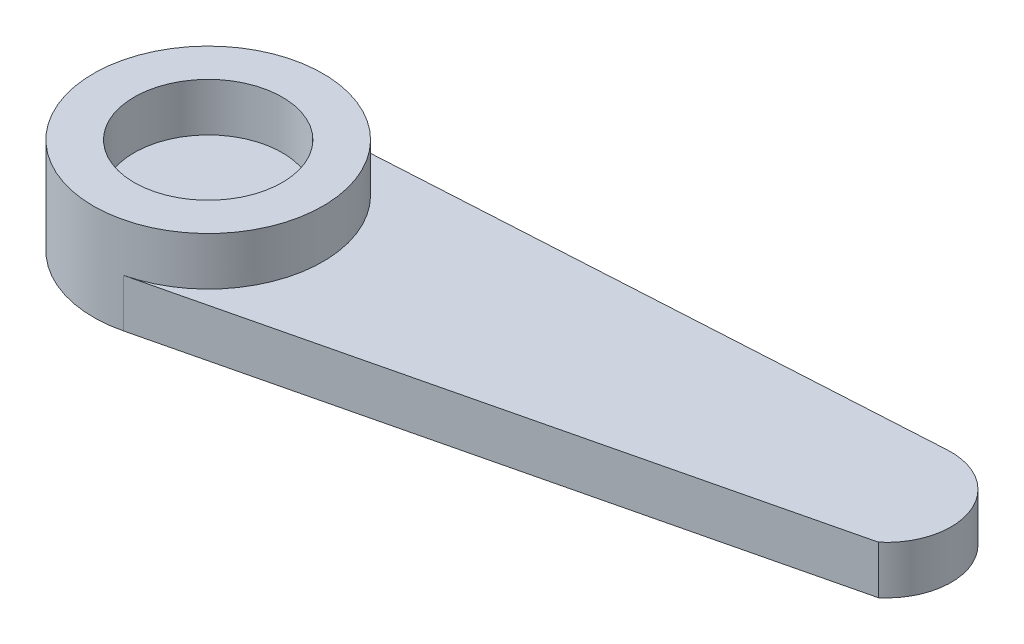
ISO-10303-21;
HEADER;
FILE_DESCRIPTION(('STEP AP214'),'2;1');
FILE_NAME('part.step','',(''),(''),'','','');
FILE_SCHEMA(('AUTOMOTIVE_DESIGN { 1 0 10303 214 1 1 1 1 }'));
ENDSEC;
DATA;
#1=APPLICATION_CONTEXT('core data for automotive mechanical design processes');
#2=APPLICATION_PROTOCOL_DEFINITION('international standard','automotive_design',2000,#1);
#3=PRODUCT_CONTEXT('',#1,'mechanical');
#4=PRODUCT('Part','Part','',(#3));
#5=PRODUCT_RELATED_PRODUCT_CATEGORY('part','',(#4));
#6=PRODUCT_DEFINITION_FORMATION('','',#4);
#7=PRODUCT_DEFINITION_CONTEXT('part definition',#1,'design');
#8=PRODUCT_DEFINITION('design','',#6,#7);
#9=PRODUCT_DEFINITION_SHAPE('','',#8);
#10=(LENGTH_UNIT() NAMED_UNIT(*) SI_UNIT(.MILLI.,.METRE.));
#11=(NAMED_UNIT(*) PLANE_ANGLE_UNIT() SI_UNIT($,.RADIAN.));
#12=(NAMED_UNIT(*) SI_UNIT($,.STERADIAN.) SOLID_ANGLE_UNIT());
#13=UNCERTAINTY_MEASURE_WITH_UNIT(LENGTH_MEASURE(1.E-05),#10,'distance_accuracy_value','');
#14=(GEOMETRIC_REPRESENTATION_CONTEXT(3) GLOBAL_UNCERTAINTY_ASSIGNED_CONTEXT((#13)) GLOBAL_UNIT_ASSIGNED_CONTEXT((#10,
#11,#12)) REPRESENTATION_CONTEXT('',''));
#15=CARTESIAN_POINT('',(0.,0.,0.));
#16=DIRECTION('',(0.,0.,1.));
#17=DIRECTION('',(1.,0.,0.));
#18=AXIS2_PLACEMENT_3D('',#15,#16,#17);
#19=CARTESIAN_POINT('',(0.,1.3,0.));
#20=DIRECTION('',(0.,-1.,0.));
#21=DIRECTION('',(0.,0.,-1.));
#22=AXIS2_PLACEMENT_3D('',#19,#20,#21);
#23=CYLINDRICAL_SURFACE('',#22,3.1);
#24=CARTESIAN_POINT('',(0.,0.,0.));
#25=DIRECTION('',(0.,1.,0.));
#26=DIRECTION('',(0.,0.,1.));
#27=AXIS2_PLACEMENT_3D('',#24,#25,#26);
#28=CIRCLE('',#27,3.1);
#29=CARTESIAN_POINT('',(-0.178960563613639,0.,-3.0948300626482));
#30=VERTEX_POINT('',#29);
#31=CARTESIAN_POINT('',(0.72507649934474,0.,3.01401129229769));
#32=VERTEX_POINT('',#31);
#33=EDGE_CURVE('E90',#30,#32,#28,.T.);
#34=ORIENTED_EDGE('',*,*,#33,.T.);
#35=DIRECTION('',(0.,-1.,0.));
#36=VECTOR('',#35,1.);
#37=CARTESIAN_POINT('',(0.72507649934474,1.3,3.01401129229769));
#38=LINE('',#37,#36);
#39=CARTESIAN_POINT('',(0.72507649934474,1.3,3.01401129229769));
#40=VERTEX_POINT('',#39);
#41=EDGE_CURVE('E11',#40,#32,#38,.T.);
#42=ORIENTED_EDGE('',*,*,#41,.F.);
#43=CARTESIAN_POINT('',(0.,1.3,0.));
#44=DIRECTION('',(0.,1.,0.));
#45=DIRECTION('',(0.,0.,1.));
#46=AXIS2_PLACEMENT_3D('',#43,#44,#45);
#47=CIRCLE('',#46,3.1);
#48=CARTESIAN_POINT('',(-0.178960563613639,1.3,-3.0948300626482));
#49=VERTEX_POINT('',#48);
#50=EDGE_CURVE('E88',#40,#49,#47,.T.);
#51=ORIENTED_EDGE('',*,*,#50,.T.);
#52=DIRECTION('',(0.,-1.,0.));
#53=VECTOR('',#52,1.);
#54=CARTESIAN_POINT('',(-0.178960563613639,1.3,-3.0948300626482));
#55=LINE('',#54,#53);
#56=EDGE_CURVE('E109',#49,#30,#55,.T.);
#57=ORIENTED_EDGE('',*,*,#56,.T.);
#58=EDGE_LOOP('',(#34,#42,#51,#57));
#59=FACE_BOUND('',#58,.T.);
#60=CARTESIAN_POINT('',(0.,2.6,0.));
#61=DIRECTION('',(0.,1.,0.));
#62=DIRECTION('',(0.,0.,1.));
#63=AXIS2_PLACEMENT_3D('',#60,#61,#62);
#64=CIRCLE('',#63,3.1);
#65=CARTESIAN_POINT('',(0.,2.6,3.1));
#66=VERTEX_POINT('',#65);
#67=EDGE_CURVE('E97',#66,#66,#64,.T.);
#68=ORIENTED_EDGE('',*,*,#67,.F.);
#69=EDGE_LOOP('',(#68));
#70=FACE_BOUND('',#69,.T.);
#71=ADVANCED_FACE('F37',(#59,#70),#23,.T.);
#72=CARTESIAN_POINT('',(0.72507649934474,1.3,3.01401129229769));
#73=DIRECTION('',(-0.233895644949916,0.,-0.972261707192802));
#74=DIRECTION('',(-0.972261707192802,0.,0.233895644949916));
#75=AXIS2_PLACEMENT_3D('',#72,#73,#74);
#76=PLANE('',#75);
#77=DIRECTION('',(0.972261707192802,0.,-0.233895644949916));
#78=VECTOR('',#77,1.);
#79=CARTESIAN_POINT('',(0.72507649934474,0.,3.01401129229769));
#80=LINE('',#79,#78);
#81=CARTESIAN_POINT('',(17.1590696545849,0.,-0.939491555454773));
#82=VERTEX_POINT('',#81);
#83=EDGE_CURVE('E111',#32,#82,#80,.T.);
#84=ORIENTED_EDGE('',*,*,#83,.T.);
#85=DIRECTION('',(0.,-1.,0.));
#86=VECTOR('',#85,1.);
#87=CARTESIAN_POINT('',(17.1590696545849,1.3,-0.939491555454773));
#88=LINE('',#87,#86);
#89=CARTESIAN_POINT('',(17.1590696545849,1.3,-0.939491555454773));
#90=VERTEX_POINT('',#89);
#91=EDGE_CURVE('E45',#90,#82,#88,.T.);
#92=ORIENTED_EDGE('',*,*,#91,.F.);
#93=DIRECTION('',(0.972261707192802,0.,-0.233895644949916));
#94=VECTOR('',#93,1.);
#95=CARTESIAN_POINT('',(0.72507649934474,1.3,3.01401129229769));
#96=LINE('',#95,#94);
#97=EDGE_CURVE('E80',#40,#90,#96,.T.);
#98=ORIENTED_EDGE('',*,*,#97,.F.);
#99=ORIENTED_EDGE('',*,*,#41,.T.);
#100=EDGE_LOOP('',(#84,#92,#98,#99));
#101=FACE_BOUND('',#100,.T.);
#102=ADVANCED_FACE('F92',(#101),#76,.F.);
#103=CARTESIAN_POINT('',(16.0333898491626,1.3,-2.27939639374158));
#104=DIRECTION('',(0.,-1.,0.));
#105=DIRECTION('',(0.,0.,-1.));
#106=AXIS2_PLACEMENT_3D('',#103,#104,#105);
#107=CYLINDRICAL_SURFACE('',#106,1.75);
#108=CARTESIAN_POINT('',(16.0333898491626,0.,-2.27939639374158));
#109=DIRECTION('',(0.,1.,0.));
#110=DIRECTION('',(0.,0.,1.));
#111=AXIS2_PLACEMENT_3D('',#108,#109,#110);
#112=CIRCLE('',#111,1.75);
#113=CARTESIAN_POINT('',(15.932363724542,0.,-4.0264778807204));
#114=VERTEX_POINT('',#113);
#115=EDGE_CURVE('E71',#82,#114,#112,.T.);
#116=ORIENTED_EDGE('',*,*,#115,.T.);
#117=DIRECTION('',(0.,-1.,0.));
#118=VECTOR('',#117,1.);
#119=CARTESIAN_POINT('',(15.932363724542,1.3,-4.0264778807204));
#120=LINE('',#119,#118);
#121=CARTESIAN_POINT('',(15.932363724542,1.3,-4.0264778807204));
#122=VERTEX_POINT('',#121);
#123=EDGE_CURVE('E116',#122,#114,#120,.T.);
#124=ORIENTED_EDGE('',*,*,#123,.F.);
#125=CARTESIAN_POINT('',(16.0333898491626,1.3,-2.27939639374158));
#126=DIRECTION('',(0.,1.,0.));
#127=DIRECTION('',(0.,0.,1.));
#128=AXIS2_PLACEMENT_3D('',#125,#126,#127);
#129=CIRCLE('',#128,1.75);
#130=EDGE_CURVE('E94',#90,#122,#129,.T.);
#131=ORIENTED_EDGE('',*,*,#130,.F.);
#132=ORIENTED_EDGE('',*,*,#91,.T.);
#133=EDGE_LOOP('',(#116,#124,#131,#132));
#134=FACE_BOUND('',#133,.T.);
#135=ADVANCED_FACE('F117',(#134),#107,.T.);
#136=CARTESIAN_POINT('',(-0.178960563613639,1.3,-3.0948300626482));
#137=DIRECTION('',(0.0577292140689159,0.,0.998332278273614));
#138=DIRECTION('',(0.998332278273614,0.,-0.0577292140689159));
#139=AXIS2_PLACEMENT_3D('',#136,#137,#138);
#140=PLANE('',#139);
#141=DIRECTION('',(-0.998332278273614,0.,0.0577292140689159));
#142=VECTOR('',#141,1.);
#143=CARTESIAN_POINT('',(-0.178960563613639,0.,-3.0948300626482));
#144=LINE('',#143,#142);
#145=EDGE_CURVE('E76',#114,#30,#144,.T.);
#146=ORIENTED_EDGE('',*,*,#145,.T.);
#147=ORIENTED_EDGE('',*,*,#56,.F.);
#148=DIRECTION('',(-0.998332278273614,0.,0.0577292140689159));
#149=VECTOR('',#148,1.);
#150=CARTESIAN_POINT('',(-0.178960563613639,1.3,-3.0948300626482));
#151=LINE('',#150,#149);
#152=EDGE_CURVE('E53',#122,#49,#151,.T.);
#153=ORIENTED_EDGE('',*,*,#152,.F.);
#154=ORIENTED_EDGE('',*,*,#123,.T.);
#155=EDGE_LOOP('',(#146,#147,#153,#154));
#156=FACE_BOUND('',#155,.T.);
#157=ADVANCED_FACE('F130',(#156),#140,.F.);
#158=CARTESIAN_POINT('',(0.,1.3,0.));
#159=DIRECTION('',(0.,1.,0.));
#160=DIRECTION('',(0.,0.,1.));
#161=AXIS2_PLACEMENT_3D('',#158,#159,#160);
#162=PLANE('',#161);
#163=ORIENTED_EDGE('',*,*,#50,.F.);
#164=ORIENTED_EDGE('',*,*,#97,.T.);
#165=ORIENTED_EDGE('',*,*,#130,.T.);
#166=ORIENTED_EDGE('',*,*,#152,.T.);
#167=EDGE_LOOP('',(#163,#164,#165,#166));
#168=FACE_BOUND('',#167,.T.);
#169=ADVANCED_FACE('F96',(#168),#162,.T.);
#170=CARTESIAN_POINT('',(0.,0.,0.));
#171=DIRECTION('',(0.,1.,0.));
#172=DIRECTION('',(0.,0.,1.));
#173=AXIS2_PLACEMENT_3D('',#170,#171,#172);
#174=PLANE('',#173);
#175=ORIENTED_EDGE('',*,*,#33,.F.);
#176=ORIENTED_EDGE('',*,*,#145,.F.);
#177=ORIENTED_EDGE('',*,*,#115,.F.);
#178=ORIENTED_EDGE('',*,*,#83,.F.);
#179=EDGE_LOOP('',(#175,#176,#177,#178));
#180=FACE_BOUND('',#179,.T.);
#181=ADVANCED_FACE('F119',(#180),#174,.F.);
#182=CARTESIAN_POINT('',(0.,2.6,0.));
#183=DIRECTION('',(0.,1.,0.));
#184=DIRECTION('',(0.,0.,1.));
#185=AXIS2_PLACEMENT_3D('',#182,#183,#184);
#186=PLANE('',#185);
#187=ORIENTED_EDGE('',*,*,#67,.T.);
#188=EDGE_LOOP('',(#187));
#189=FACE_BOUND('',#188,.T.);
#190=CARTESIAN_POINT('',(0.,2.6,0.));
#191=DIRECTION('',(0.,1.,0.));
#192=DIRECTION('',(0.,0.,1.));
#193=AXIS2_PLACEMENT_3D('',#190,#191,#192);
#194=CIRCLE('',#193,2.);
#195=CARTESIAN_POINT('',(0.,2.6,2.));
#196=VERTEX_POINT('',#195);
#197=EDGE_CURVE('E98',#196,#196,#194,.T.);
#198=ORIENTED_EDGE('',*,*,#197,.F.);
#199=EDGE_LOOP('',(#198));
#200=FACE_BOUND('',#199,.T.);
#201=ADVANCED_FACE('F121',(#189,#200),#186,.T.);
#202=CARTESIAN_POINT('',(0.,2.6,0.));
#203=DIRECTION('',(0.,-1.,0.));
#204=DIRECTION('',(0.,0.,-1.));
#205=AXIS2_PLACEMENT_3D('',#202,#203,#204);
#206=CYLINDRICAL_SURFACE('',#205,2.);
#207=ORIENTED_EDGE('',*,*,#197,.T.);
#208=EDGE_LOOP('',(#207));
#209=FACE_BOUND('',#208,.T.);
#210=CARTESIAN_POINT('',(0.,1.3,0.));
#211=DIRECTION('',(0.,1.,0.));
#212=DIRECTION('',(0.,0.,1.));
#213=AXIS2_PLACEMENT_3D('',#210,#211,#212);
#214=CIRCLE('',#213,2.);
#215=CARTESIAN_POINT('',(0.,1.3,2.));
#216=VERTEX_POINT('',#215);
#217=EDGE_CURVE('E103',#216,#216,#214,.T.);
#218=ORIENTED_EDGE('',*,*,#217,.F.);
#219=EDGE_LOOP('',(#218));
#220=FACE_BOUND('',#219,.T.);
#221=ADVANCED_FACE('F127',(#209,#220),#206,.F.);
#222=ORIENTED_EDGE('',*,*,#217,.T.);
#223=EDGE_LOOP('',(#222));
#224=FACE_BOUND('',#223,.T.);
#225=ADVANCED_FACE('F132',(#224),#162,.T.);
#226=CLOSED_SHELL('',(#71,#102,#135,#157,#169,#181,#201,#221,#225));
#227=MANIFOLD_SOLID_BREP('B2',#226);
#228=ADVANCED_BREP_SHAPE_REPRESENTATION('',(#18,#227),#14);
#229=SHAPE_DEFINITION_REPRESENTATION(#9,#228);
ENDSEC;
END-ISO-10303-21;
